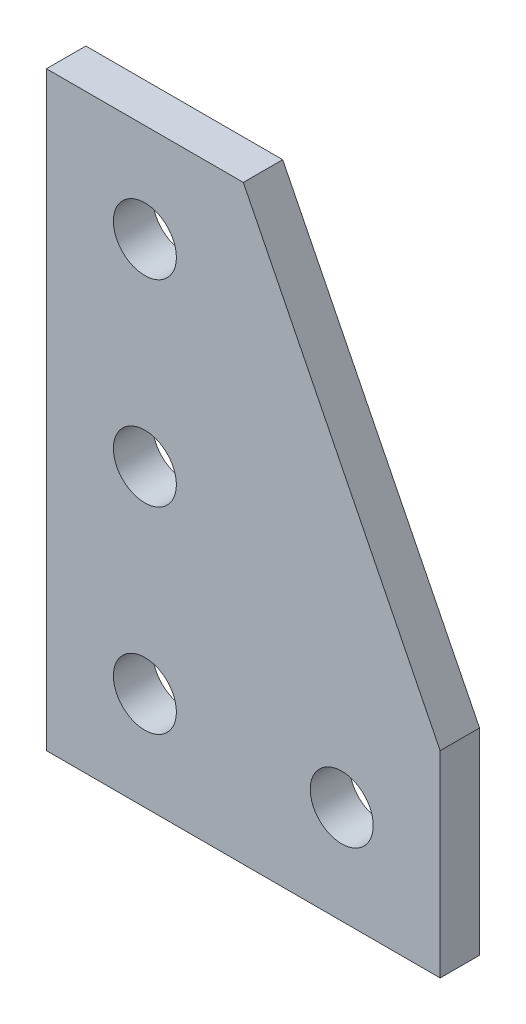
ISO-10303-21;
HEADER;
FILE_DESCRIPTION(('STEP AP214'),'2;1');
FILE_NAME('part.step','',(''),(''),'','','');
FILE_SCHEMA(('AUTOMOTIVE_DESIGN { 1 0 10303 214 1 1 1 1 }'));
ENDSEC;
DATA;
#1=APPLICATION_CONTEXT('core data for automotive mechanical design processes');
#2=APPLICATION_PROTOCOL_DEFINITION('international standard','automotive_design',2000,#1);
#3=PRODUCT_CONTEXT('',#1,'mechanical');
#4=PRODUCT('Part','Part','',(#3));
#5=PRODUCT_RELATED_PRODUCT_CATEGORY('part','',(#4));
#6=PRODUCT_DEFINITION_FORMATION('','',#4);
#7=PRODUCT_DEFINITION_CONTEXT('part definition',#1,'design');
#8=PRODUCT_DEFINITION('design','',#6,#7);
#9=PRODUCT_DEFINITION_SHAPE('','',#8);
#10=(LENGTH_UNIT() NAMED_UNIT(*) SI_UNIT(.MILLI.,.METRE.));
#11=(NAMED_UNIT(*) PLANE_ANGLE_UNIT() SI_UNIT($,.RADIAN.));
#12=(NAMED_UNIT(*) SI_UNIT($,.STERADIAN.) SOLID_ANGLE_UNIT());
#13=UNCERTAINTY_MEASURE_WITH_UNIT(LENGTH_MEASURE(1.E-05),#10,'distance_accuracy_value','');
#14=(GEOMETRIC_REPRESENTATION_CONTEXT(3) GLOBAL_UNCERTAINTY_ASSIGNED_CONTEXT((#13)) GLOBAL_UNIT_ASSIGNED_CONTEXT((#10,
#11,#12)) REPRESENTATION_CONTEXT('',''));
#15=CARTESIAN_POINT('',(0.,0.,0.));
#16=DIRECTION('',(0.,0.,1.));
#17=DIRECTION('',(1.,0.,0.));
#18=AXIS2_PLACEMENT_3D('',#15,#16,#17);
#19=CARTESIAN_POINT('',(0.,0.,2.));
#20=DIRECTION('',(0.,0.,-1.));
#21=DIRECTION('',(-1.,0.,0.));
#22=AXIS2_PLACEMENT_3D('',#19,#20,#21);
#23=PLANE('',#22);
#24=DIRECTION('',(1.,0.,0.));
#25=VECTOR('',#24,1.);
#26=CARTESIAN_POINT('',(20.,0.,2.));
#27=LINE('',#26,#25);
#28=CARTESIAN_POINT('',(0.,0.,2.));
#29=VERTEX_POINT('',#28);
#30=CARTESIAN_POINT('',(20.,0.,2.));
#31=VERTEX_POINT('',#30);
#32=EDGE_CURVE('E117',#29,#31,#27,.T.);
#33=ORIENTED_EDGE('',*,*,#32,.T.);
#34=DIRECTION('',(0.,1.,0.));
#35=VECTOR('',#34,1.);
#36=CARTESIAN_POINT('',(20.,10.,2.));
#37=LINE('',#36,#35);
#38=CARTESIAN_POINT('',(20.,10.,2.));
#39=VERTEX_POINT('',#38);
#40=EDGE_CURVE('E84',#31,#39,#37,.T.);
#41=ORIENTED_EDGE('',*,*,#40,.T.);
#42=DIRECTION('',(-0.447213595499958,0.894427190999916,0.));
#43=VECTOR('',#42,1.);
#44=CARTESIAN_POINT('',(10.,30.,2.));
#45=LINE('',#44,#43);
#46=CARTESIAN_POINT('',(10.,30.,2.));
#47=VERTEX_POINT('',#46);
#48=EDGE_CURVE('E88',#39,#47,#45,.T.);
#49=ORIENTED_EDGE('',*,*,#48,.T.);
#50=DIRECTION('',(-1.,0.,0.));
#51=VECTOR('',#50,1.);
#52=CARTESIAN_POINT('',(0.,30.,2.));
#53=LINE('',#52,#51);
#54=CARTESIAN_POINT('',(0.,30.,2.));
#55=VERTEX_POINT('',#54);
#56=EDGE_CURVE('E92',#47,#55,#53,.T.);
#57=ORIENTED_EDGE('',*,*,#56,.T.);
#58=DIRECTION('',(0.,-1.,0.));
#59=VECTOR('',#58,1.);
#60=CARTESIAN_POINT('',(0.,0.,2.));
#61=LINE('',#60,#59);
#62=EDGE_CURVE('E50',#55,#29,#61,.T.);
#63=ORIENTED_EDGE('',*,*,#62,.T.);
#64=EDGE_LOOP('',(#33,#41,#49,#57,#63));
#65=FACE_BOUND('',#64,.T.);
#66=CARTESIAN_POINT('',(5.,25.,2.));
#67=DIRECTION('',(0.,0.,1.));
#68=DIRECTION('',(1.,0.,0.));
#69=AXIS2_PLACEMENT_3D('',#66,#67,#68);
#70=CIRCLE('',#69,1.6);
#71=CARTESIAN_POINT('',(6.6,25.,2.));
#72=VERTEX_POINT('',#71);
#73=EDGE_CURVE('E112',#72,#72,#70,.T.);
#74=ORIENTED_EDGE('',*,*,#73,.F.);
#75=EDGE_LOOP('',(#74));
#76=FACE_BOUND('',#75,.T.);
#77=CARTESIAN_POINT('',(5.,15.,2.));
#78=DIRECTION('',(0.,0.,1.));
#79=DIRECTION('',(1.,0.,0.));
#80=AXIS2_PLACEMENT_3D('',#77,#78,#79);
#81=CIRCLE('',#80,1.6);
#82=CARTESIAN_POINT('',(6.6,15.,2.));
#83=VERTEX_POINT('',#82);
#84=EDGE_CURVE('E176',#83,#83,#81,.T.);
#85=ORIENTED_EDGE('',*,*,#84,.F.);
#86=EDGE_LOOP('',(#85));
#87=FACE_BOUND('',#86,.T.);
#88=CARTESIAN_POINT('',(5.,5.,2.));
#89=DIRECTION('',(0.,0.,1.));
#90=DIRECTION('',(1.,0.,0.));
#91=AXIS2_PLACEMENT_3D('',#88,#89,#90);
#92=CIRCLE('',#91,1.6);
#93=CARTESIAN_POINT('',(6.6,5.,2.));
#94=VERTEX_POINT('',#93);
#95=EDGE_CURVE('E170',#94,#94,#92,.T.);
#96=ORIENTED_EDGE('',*,*,#95,.F.);
#97=EDGE_LOOP('',(#96));
#98=FACE_BOUND('',#97,.T.);
#99=CARTESIAN_POINT('',(15.,5.,2.));
#100=DIRECTION('',(0.,0.,1.));
#101=DIRECTION('',(1.,0.,0.));
#102=AXIS2_PLACEMENT_3D('',#99,#100,#101);
#103=CIRCLE('',#102,1.6);
#104=CARTESIAN_POINT('',(16.6,5.,2.));
#105=VERTEX_POINT('',#104);
#106=EDGE_CURVE('E161',#105,#105,#103,.T.);
#107=ORIENTED_EDGE('',*,*,#106,.F.);
#108=EDGE_LOOP('',(#107));
#109=FACE_BOUND('',#108,.T.);
#110=ADVANCED_FACE('F33',(#65,#76,#87,#98,#109),#23,.F.);
#111=CARTESIAN_POINT('',(0.,0.,0.));
#112=DIRECTION('',(0.,0.,-1.));
#113=DIRECTION('',(-1.,0.,0.));
#114=AXIS2_PLACEMENT_3D('',#111,#112,#113);
#115=PLANE('',#114);
#116=CARTESIAN_POINT('',(5.,5.,0.));
#117=DIRECTION('',(0.,0.,1.));
#118=DIRECTION('',(1.,0.,0.));
#119=AXIS2_PLACEMENT_3D('',#116,#117,#118);
#120=CIRCLE('',#119,1.6);
#121=CARTESIAN_POINT('',(6.6,5.,0.));
#122=VERTEX_POINT('',#121);
#123=EDGE_CURVE('E167',#122,#122,#120,.T.);
#124=ORIENTED_EDGE('',*,*,#123,.T.);
#125=EDGE_LOOP('',(#124));
#126=FACE_BOUND('',#125,.T.);
#127=CARTESIAN_POINT('',(5.,25.,0.));
#128=DIRECTION('',(0.,0.,1.));
#129=DIRECTION('',(1.,0.,0.));
#130=AXIS2_PLACEMENT_3D('',#127,#128,#129);
#131=CIRCLE('',#130,1.6);
#132=CARTESIAN_POINT('',(6.6,25.,0.));
#133=VERTEX_POINT('',#132);
#134=EDGE_CURVE('E179',#133,#133,#131,.T.);
#135=ORIENTED_EDGE('',*,*,#134,.T.);
#136=EDGE_LOOP('',(#135));
#137=FACE_BOUND('',#136,.T.);
#138=DIRECTION('',(1.,0.,0.));
#139=VECTOR('',#138,1.);
#140=CARTESIAN_POINT('',(20.,0.,0.));
#141=LINE('',#140,#139);
#142=CARTESIAN_POINT('',(0.,0.,0.));
#143=VERTEX_POINT('',#142);
#144=CARTESIAN_POINT('',(20.,0.,0.));
#145=VERTEX_POINT('',#144);
#146=EDGE_CURVE('E108',#143,#145,#141,.T.);
#147=ORIENTED_EDGE('',*,*,#146,.F.);
#148=DIRECTION('',(0.,-1.,0.));
#149=VECTOR('',#148,1.);
#150=CARTESIAN_POINT('',(0.,0.,0.));
#151=LINE('',#150,#149);
#152=CARTESIAN_POINT('',(0.,30.,0.));
#153=VERTEX_POINT('',#152);
#154=EDGE_CURVE('E76',#153,#143,#151,.T.);
#155=ORIENTED_EDGE('',*,*,#154,.F.);
#156=DIRECTION('',(-1.,0.,0.));
#157=VECTOR('',#156,1.);
#158=CARTESIAN_POINT('',(0.,30.,0.));
#159=LINE('',#158,#157);
#160=CARTESIAN_POINT('',(10.,30.,0.));
#161=VERTEX_POINT('',#160);
#162=EDGE_CURVE('E70',#161,#153,#159,.T.);
#163=ORIENTED_EDGE('',*,*,#162,.F.);
#164=DIRECTION('',(-0.447213595499958,0.894427190999916,0.));
#165=VECTOR('',#164,1.);
#166=CARTESIAN_POINT('',(10.,30.,0.));
#167=LINE('',#166,#165);
#168=CARTESIAN_POINT('',(20.,10.,0.));
#169=VERTEX_POINT('',#168);
#170=EDGE_CURVE('E99',#169,#161,#167,.T.);
#171=ORIENTED_EDGE('',*,*,#170,.F.);
#172=DIRECTION('',(0.,1.,0.));
#173=VECTOR('',#172,1.);
#174=CARTESIAN_POINT('',(20.,10.,0.));
#175=LINE('',#174,#173);
#176=EDGE_CURVE('E111',#145,#169,#175,.T.);
#177=ORIENTED_EDGE('',*,*,#176,.F.);
#178=EDGE_LOOP('',(#147,#155,#163,#171,#177));
#179=FACE_BOUND('',#178,.T.);
#180=CARTESIAN_POINT('',(5.,15.,0.));
#181=DIRECTION('',(0.,0.,1.));
#182=DIRECTION('',(1.,0.,0.));
#183=AXIS2_PLACEMENT_3D('',#180,#181,#182);
#184=CIRCLE('',#183,1.6);
#185=CARTESIAN_POINT('',(6.6,15.,0.));
#186=VERTEX_POINT('',#185);
#187=EDGE_CURVE('E173',#186,#186,#184,.T.);
#188=ORIENTED_EDGE('',*,*,#187,.T.);
#189=EDGE_LOOP('',(#188));
#190=FACE_BOUND('',#189,.T.);
#191=CARTESIAN_POINT('',(15.,5.,0.));
#192=DIRECTION('',(0.,0.,1.));
#193=DIRECTION('',(1.,0.,0.));
#194=AXIS2_PLACEMENT_3D('',#191,#192,#193);
#195=CIRCLE('',#194,1.6);
#196=CARTESIAN_POINT('',(16.6,5.,0.));
#197=VERTEX_POINT('',#196);
#198=EDGE_CURVE('E164',#197,#197,#195,.T.);
#199=ORIENTED_EDGE('',*,*,#198,.T.);
#200=EDGE_LOOP('',(#199));
#201=FACE_BOUND('',#200,.T.);
#202=ADVANCED_FACE('F121',(#126,#137,#179,#190,#201),#115,.T.);
#203=CARTESIAN_POINT('',(20.,0.,2.));
#204=DIRECTION('',(0.,1.,0.));
#205=DIRECTION('',(-1.,0.,0.));
#206=AXIS2_PLACEMENT_3D('',#203,#204,#205);
#207=PLANE('',#206);
#208=ORIENTED_EDGE('',*,*,#146,.T.);
#209=DIRECTION('',(0.,0.,-1.));
#210=VECTOR('',#209,1.);
#211=CARTESIAN_POINT('',(20.,0.,2.));
#212=LINE('',#211,#210);
#213=EDGE_CURVE('E11',#31,#145,#212,.T.);
#214=ORIENTED_EDGE('',*,*,#213,.F.);
#215=ORIENTED_EDGE('',*,*,#32,.F.);
#216=DIRECTION('',(0.,0.,-1.));
#217=VECTOR('',#216,1.);
#218=CARTESIAN_POINT('',(0.,0.,2.));
#219=LINE('',#218,#217);
#220=EDGE_CURVE('E104',#29,#143,#219,.T.);
#221=ORIENTED_EDGE('',*,*,#220,.T.);
#222=EDGE_LOOP('',(#208,#214,#215,#221));
#223=FACE_BOUND('',#222,.T.);
#224=ADVANCED_FACE('F35',(#223),#207,.F.);
#225=CARTESIAN_POINT('',(20.,10.,2.));
#226=DIRECTION('',(-1.,0.,0.));
#227=DIRECTION('',(0.,0.,1.));
#228=AXIS2_PLACEMENT_3D('',#225,#226,#227);
#229=PLANE('',#228);
#230=ORIENTED_EDGE('',*,*,#176,.T.);
#231=DIRECTION('',(0.,0.,-1.));
#232=VECTOR('',#231,1.);
#233=CARTESIAN_POINT('',(20.,10.,2.));
#234=LINE('',#233,#232);
#235=EDGE_CURVE('E42',#39,#169,#234,.T.);
#236=ORIENTED_EDGE('',*,*,#235,.F.);
#237=ORIENTED_EDGE('',*,*,#40,.F.);
#238=ORIENTED_EDGE('',*,*,#213,.T.);
#239=EDGE_LOOP('',(#230,#236,#237,#238));
#240=FACE_BOUND('',#239,.T.);
#241=ADVANCED_FACE('F230',(#240),#229,.F.);
#242=CARTESIAN_POINT('',(10.,30.,2.));
#243=DIRECTION('',(-0.894427190999916,-0.447213595499958,0.));
#244=DIRECTION('',(0.447213595499958,-0.894427190999916,0.));
#245=AXIS2_PLACEMENT_3D('',#242,#243,#244);
#246=PLANE('',#245);
#247=ORIENTED_EDGE('',*,*,#170,.T.);
#248=DIRECTION('',(0.,0.,-1.));
#249=VECTOR('',#248,1.);
#250=CARTESIAN_POINT('',(10.,30.,2.));
#251=LINE('',#250,#249);
#252=EDGE_CURVE('E96',#47,#161,#251,.T.);
#253=ORIENTED_EDGE('',*,*,#252,.F.);
#254=ORIENTED_EDGE('',*,*,#48,.F.);
#255=ORIENTED_EDGE('',*,*,#235,.T.);
#256=EDGE_LOOP('',(#247,#253,#254,#255));
#257=FACE_BOUND('',#256,.T.);
#258=ADVANCED_FACE('F97',(#257),#246,.F.);
#259=CARTESIAN_POINT('',(0.,30.,2.));
#260=DIRECTION('',(0.,-1.,0.));
#261=DIRECTION('',(0.,0.,-1.));
#262=AXIS2_PLACEMENT_3D('',#259,#260,#261);
#263=PLANE('',#262);
#264=ORIENTED_EDGE('',*,*,#162,.T.);
#265=DIRECTION('',(0.,0.,-1.));
#266=VECTOR('',#265,1.);
#267=CARTESIAN_POINT('',(0.,30.,2.));
#268=LINE('',#267,#266);
#269=EDGE_CURVE('E100',#55,#153,#268,.T.);
#270=ORIENTED_EDGE('',*,*,#269,.F.);
#271=ORIENTED_EDGE('',*,*,#56,.F.);
#272=ORIENTED_EDGE('',*,*,#252,.T.);
#273=EDGE_LOOP('',(#264,#270,#271,#272));
#274=FACE_BOUND('',#273,.T.);
#275=ADVANCED_FACE('F102',(#274),#263,.F.);
#276=CARTESIAN_POINT('',(0.,0.,2.));
#277=DIRECTION('',(1.,0.,0.));
#278=DIRECTION('',(0.,0.,-1.));
#279=AXIS2_PLACEMENT_3D('',#276,#277,#278);
#280=PLANE('',#279);
#281=ORIENTED_EDGE('',*,*,#154,.T.);
#282=ORIENTED_EDGE('',*,*,#220,.F.);
#283=ORIENTED_EDGE('',*,*,#62,.F.);
#284=ORIENTED_EDGE('',*,*,#269,.T.);
#285=EDGE_LOOP('',(#281,#282,#283,#284));
#286=FACE_BOUND('',#285,.T.);
#287=ADVANCED_FACE('F126',(#286),#280,.F.);
#288=CARTESIAN_POINT('',(5.,25.,2.));
#289=DIRECTION('',(0.,0.,-1.));
#290=DIRECTION('',(-1.,0.,0.));
#291=AXIS2_PLACEMENT_3D('',#288,#289,#290);
#292=CYLINDRICAL_SURFACE('',#291,1.6);
#293=ORIENTED_EDGE('',*,*,#73,.T.);
#294=EDGE_LOOP('',(#293));
#295=FACE_BOUND('',#294,.T.);
#296=ORIENTED_EDGE('',*,*,#134,.F.);
#297=EDGE_LOOP('',(#296));
#298=FACE_BOUND('',#297,.T.);
#299=ADVANCED_FACE('F128',(#295,#298),#292,.F.);
#300=CARTESIAN_POINT('',(5.,15.,2.));
#301=DIRECTION('',(0.,0.,-1.));
#302=DIRECTION('',(-1.,0.,0.));
#303=AXIS2_PLACEMENT_3D('',#300,#301,#302);
#304=CYLINDRICAL_SURFACE('',#303,1.6);
#305=ORIENTED_EDGE('',*,*,#84,.T.);
#306=EDGE_LOOP('',(#305));
#307=FACE_BOUND('',#306,.T.);
#308=ORIENTED_EDGE('',*,*,#187,.F.);
#309=EDGE_LOOP('',(#308));
#310=FACE_BOUND('',#309,.T.);
#311=ADVANCED_FACE('F134',(#307,#310),#304,.F.);
#312=CARTESIAN_POINT('',(5.,5.,2.));
#313=DIRECTION('',(0.,0.,-1.));
#314=DIRECTION('',(-1.,0.,0.));
#315=AXIS2_PLACEMENT_3D('',#312,#313,#314);
#316=CYLINDRICAL_SURFACE('',#315,1.6);
#317=ORIENTED_EDGE('',*,*,#95,.T.);
#318=EDGE_LOOP('',(#317));
#319=FACE_BOUND('',#318,.T.);
#320=ORIENTED_EDGE('',*,*,#123,.F.);
#321=EDGE_LOOP('',(#320));
#322=FACE_BOUND('',#321,.T.);
#323=ADVANCED_FACE('F148',(#319,#322),#316,.F.);
#324=CARTESIAN_POINT('',(15.,5.,2.));
#325=DIRECTION('',(0.,0.,-1.));
#326=DIRECTION('',(-1.,0.,0.));
#327=AXIS2_PLACEMENT_3D('',#324,#325,#326);
#328=CYLINDRICAL_SURFACE('',#327,1.6);
#329=ORIENTED_EDGE('',*,*,#106,.T.);
#330=EDGE_LOOP('',(#329));
#331=FACE_BOUND('',#330,.T.);
#332=ORIENTED_EDGE('',*,*,#198,.F.);
#333=EDGE_LOOP('',(#332));
#334=FACE_BOUND('',#333,.T.);
#335=ADVANCED_FACE('F152',(#331,#334),#328,.F.);
#336=CLOSED_SHELL('',(#110,#202,#224,#241,#258,#275,#287,#299,#311,#323,#335));
#337=MANIFOLD_SOLID_BREP('B2',#336);
#338=ADVANCED_BREP_SHAPE_REPRESENTATION('',(#18,#337),#14);
#339=SHAPE_DEFINITION_REPRESENTATION(#9,#338);
ENDSEC;
END-ISO-10303-21;
